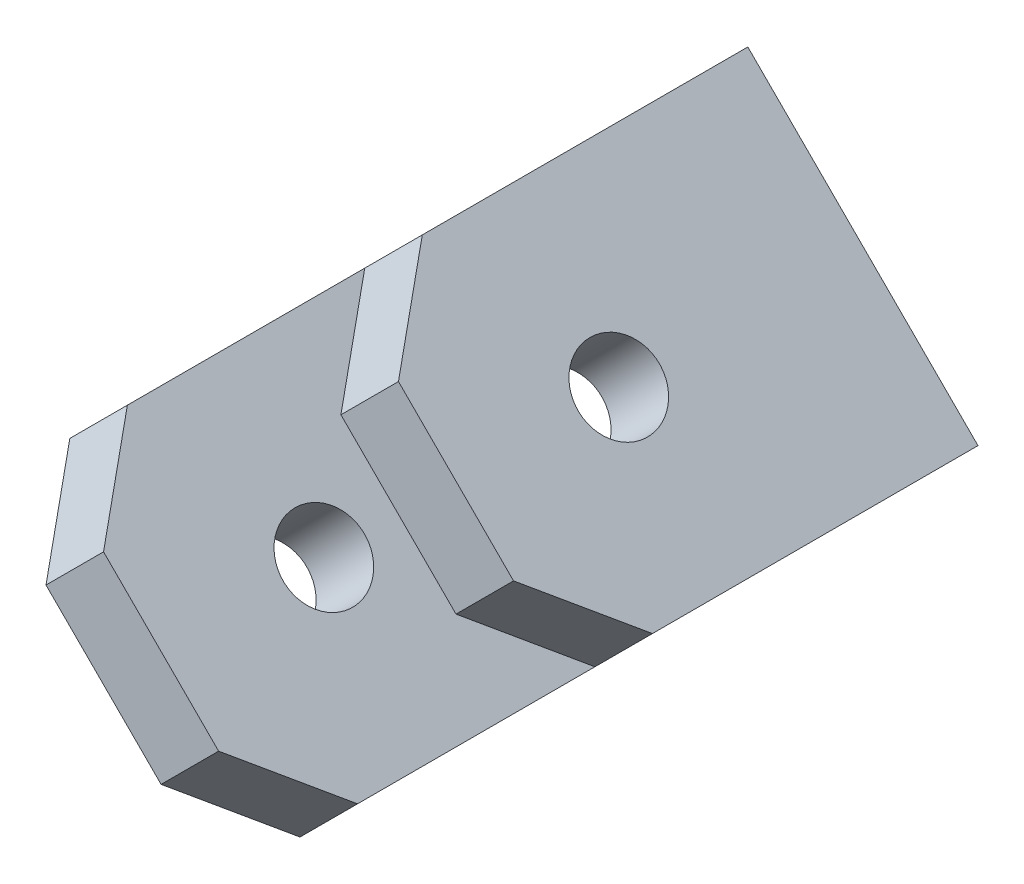
ISO-10303-21;
HEADER;
FILE_DESCRIPTION(('STEP AP214'),'2;1');
FILE_NAME('part.step','',(''),(''),'','','');
FILE_SCHEMA(('AUTOMOTIVE_DESIGN { 1 0 10303 214 1 1 1 1 }'));
ENDSEC;
DATA;
#1=APPLICATION_CONTEXT('core data for automotive mechanical design processes');
#2=APPLICATION_PROTOCOL_DEFINITION('international standard','automotive_design',2000,#1);
#3=PRODUCT_CONTEXT('',#1,'mechanical');
#4=PRODUCT('Part','Part','',(#3));
#5=PRODUCT_RELATED_PRODUCT_CATEGORY('part','',(#4));
#6=PRODUCT_DEFINITION_FORMATION('','',#4);
#7=PRODUCT_DEFINITION_CONTEXT('part definition',#1,'design');
#8=PRODUCT_DEFINITION('design','',#6,#7);
#9=PRODUCT_DEFINITION_SHAPE('','',#8);
#10=(LENGTH_UNIT() NAMED_UNIT(*) SI_UNIT(.MILLI.,.METRE.));
#11=(NAMED_UNIT(*) PLANE_ANGLE_UNIT() SI_UNIT($,.RADIAN.));
#12=(NAMED_UNIT(*) SI_UNIT($,.STERADIAN.) SOLID_ANGLE_UNIT());
#13=UNCERTAINTY_MEASURE_WITH_UNIT(LENGTH_MEASURE(1.E-05),#10,'distance_accuracy_value','');
#14=(GEOMETRIC_REPRESENTATION_CONTEXT(3) GLOBAL_UNCERTAINTY_ASSIGNED_CONTEXT((#13)) GLOBAL_UNIT_ASSIGNED_CONTEXT((#10,
#11,#12)) REPRESENTATION_CONTEXT('',''));
#15=CARTESIAN_POINT('',(0.,0.,0.));
#16=DIRECTION('',(0.,0.,1.));
#17=DIRECTION('',(1.,0.,0.));
#18=AXIS2_PLACEMENT_3D('',#15,#16,#17);
#19=CARTESIAN_POINT('',(90.9250932258255,19.0830442572713,127.));
#20=DIRECTION('',(-0.707106781186543,0.707106781186552,0.));
#21=DIRECTION('',(-0.707106781186552,-0.707106781186543,0.));
#22=AXIS2_PLACEMENT_3D('',#19,#20,#21);
#23=PLANE('',#22);
#24=DIRECTION('',(0.,0.,-1.));
#25=VECTOR('',#24,1.);
#26=CARTESIAN_POINT('',(90.9250932258255,19.0830442572713,127.));
#27=LINE('',#26,#25);
#28=CARTESIAN_POINT('',(90.9250932258255,19.0830442572713,101.6));
#29=VERTEX_POINT('',#28);
#30=CARTESIAN_POINT('',(90.9250932258255,19.0830442572713,0.));
#31=VERTEX_POINT('',#30);
#32=EDGE_CURVE('E124',#29,#31,#27,.T.);
#33=ORIENTED_EDGE('',*,*,#32,.F.);
#34=DIRECTION('',(0.707106781186551,0.707106781186544,0.));
#35=VECTOR('',#34,1.);
#36=CARTESIAN_POINT('',(-55.004068741549,-126.846117710102,101.6));
#37=LINE('',#36,#35);
#38=CARTESIAN_POINT('',(72.964580983687,1.12253201513307,101.6));
#39=VERTEX_POINT('',#38);
#40=EDGE_CURVE('E134',#39,#29,#37,.T.);
#41=ORIENTED_EDGE('',*,*,#40,.F.);
#42=DIRECTION('',(0.,0.,-1.));
#43=VECTOR('',#42,1.);
#44=CARTESIAN_POINT('',(72.964580983687,1.1225320151331,127.));
#45=LINE('',#44,#43);
#46=CARTESIAN_POINT('',(72.964580983687,1.1225320151331,0.));
#47=VERTEX_POINT('',#46);
#48=EDGE_CURVE('E113',#39,#47,#45,.T.);
#49=ORIENTED_EDGE('',*,*,#48,.T.);
#50=DIRECTION('',(0.707106781186552,0.707106781186543,0.));
#51=VECTOR('',#50,1.);
#52=CARTESIAN_POINT('',(90.9250932258255,19.0830442572713,0.));
#53=LINE('',#52,#51);
#54=EDGE_CURVE('E133',#47,#31,#53,.T.);
#55=ORIENTED_EDGE('',*,*,#54,.T.);
#56=EDGE_LOOP('',(#33,#41,#49,#55));
#57=FACE_BOUND('',#56,.T.);
#58=ADVANCED_FACE('F43',(#57),#23,.F.);
#59=CARTESIAN_POINT('',(19.0830442572726,90.9250932258249,127.));
#60=DIRECTION('',(-0.707106781186551,-0.707106781186544,0.));
#61=DIRECTION('',(0.707106781186544,-0.707106781186551,0.));
#62=AXIS2_PLACEMENT_3D('',#59,#60,#61);
#63=PLANE('',#62);
#64=CARTESIAN_POINT('',(55.0040687415489,55.0040687415483,76.2));
#65=DIRECTION('',(0.707106781186551,0.707106781186544,0.));
#66=DIRECTION('',(-0.707106781186544,0.707106781186551,0.));
#67=AXIS2_PLACEMENT_3D('',#64,#65,#66);
#68=CIRCLE('',#67,12.7);
#69=CARTESIAN_POINT('',(46.0238126204798,63.9843248626175,76.2));
#70=VERTEX_POINT('',#69);
#71=EDGE_CURVE('E155',#70,#70,#68,.T.);
#72=ORIENTED_EDGE('',*,*,#71,.F.);
#73=EDGE_LOOP('',(#72));
#74=FACE_BOUND('',#73,.T.);
#75=DIRECTION('',(0.,0.,-1.));
#76=VECTOR('',#75,1.);
#77=CARTESIAN_POINT('',(19.0830442572726,90.9250932258249,127.));
#78=LINE('',#77,#76);
#79=CARTESIAN_POINT('',(19.0830442572722,90.9250932258253,101.6));
#80=VERTEX_POINT('',#79);
#81=CARTESIAN_POINT('',(19.0830442572726,90.9250932258249,0.));
#82=VERTEX_POINT('',#81);
#83=EDGE_CURVE('E106',#80,#82,#78,.T.);
#84=ORIENTED_EDGE('',*,*,#83,.F.);
#85=DIRECTION('',(-0.499999999999998,0.500000000000003,-0.707106781186547));
#86=VECTOR('',#85,1.);
#87=CARTESIAN_POINT('',(37.0435564994106,72.9645809836867,127.));
#88=LINE('',#87,#86);
#89=CARTESIAN_POINT('',(37.0435564994106,72.9645809836867,127.));
#90=VERTEX_POINT('',#89);
#91=EDGE_CURVE('E95',#90,#80,#88,.T.);
#92=ORIENTED_EDGE('',*,*,#91,.F.);
#93=DIRECTION('',(-0.707106781186544,0.707106781186551,0.));
#94=VECTOR('',#93,1.);
#95=CARTESIAN_POINT('',(19.0830442572726,90.9250932258249,127.));
#96=LINE('',#95,#94);
#97=CARTESIAN_POINT('',(72.9645809836871,37.0435564994099,127.));
#98=VERTEX_POINT('',#97);
#99=EDGE_CURVE('E104',#98,#90,#96,.T.);
#100=ORIENTED_EDGE('',*,*,#99,.F.);
#101=DIRECTION('',(-0.499999999999998,0.500000000000003,0.707106781186547));
#102=VECTOR('',#101,1.);
#103=CARTESIAN_POINT('',(72.9645809836871,37.0435564994099,127.));
#104=LINE('',#103,#102);
#105=EDGE_CURVE('E65',#29,#98,#104,.T.);
#106=ORIENTED_EDGE('',*,*,#105,.F.);
#107=ORIENTED_EDGE('',*,*,#32,.T.);
#108=DIRECTION('',(-0.707106781186544,0.707106781186551,0.));
#109=VECTOR('',#108,1.);
#110=CARTESIAN_POINT('',(19.0830442572726,90.9250932258249,0.));
#111=LINE('',#110,#109);
#112=EDGE_CURVE('E137',#31,#82,#111,.T.);
#113=ORIENTED_EDGE('',*,*,#112,.T.);
#114=EDGE_LOOP('',(#84,#92,#100,#106,#107,#113));
#115=FACE_BOUND('',#114,.T.);
#116=ADVANCED_FACE('F103',(#74,#115),#63,.F.);
#117=CARTESIAN_POINT('',(1.12253201513421,72.9645809836867,127.));
#118=DIRECTION('',(0.707106781186544,-0.707106781186551,0.));
#119=DIRECTION('',(0.707106781186551,0.707106781186544,0.));
#120=AXIS2_PLACEMENT_3D('',#117,#118,#119);
#121=PLANE('',#120);
#122=DIRECTION('',(0.,0.,-1.));
#123=VECTOR('',#122,1.);
#124=CARTESIAN_POINT('',(1.12253201513421,72.9645809836867,127.));
#125=LINE('',#124,#123);
#126=CARTESIAN_POINT('',(1.12253201513383,72.964580983687,101.6));
#127=VERTEX_POINT('',#126);
#128=CARTESIAN_POINT('',(1.12253201513421,72.9645809836867,0.));
#129=VERTEX_POINT('',#128);
#130=EDGE_CURVE('E121',#127,#129,#125,.T.);
#131=ORIENTED_EDGE('',*,*,#130,.F.);
#132=DIRECTION('',(0.707106781186551,0.707106781186544,0.));
#133=VECTOR('',#132,1.);
#134=CARTESIAN_POINT('',(-126.846117710102,-55.0040687415477,101.6));
#135=LINE('',#134,#133);
#136=EDGE_CURVE('E107',#127,#80,#135,.T.);
#137=ORIENTED_EDGE('',*,*,#136,.T.);
#138=ORIENTED_EDGE('',*,*,#83,.T.);
#139=DIRECTION('',(-0.707106781186551,-0.707106781186544,0.));
#140=VECTOR('',#139,1.);
#141=CARTESIAN_POINT('',(1.12253201513421,72.9645809836867,0.));
#142=LINE('',#141,#140);
#143=EDGE_CURVE('E116',#82,#129,#142,.T.);
#144=ORIENTED_EDGE('',*,*,#143,.T.);
#145=EDGE_LOOP('',(#131,#137,#138,#144));
#146=FACE_BOUND('',#145,.T.);
#147=ADVANCED_FACE('F147',(#146),#121,.F.);
#148=CARTESIAN_POINT('',(1.12253201513421,72.9645809836867,127.));
#149=DIRECTION('',(0.707106781186551,0.707106781186544,0.));
#150=DIRECTION('',(-0.707106781186544,0.707106781186551,0.));
#151=AXIS2_PLACEMENT_3D('',#148,#149,#150);
#152=PLANE('',#151);
#153=CARTESIAN_POINT('',(37.0435564994104,37.04355649941,76.2));
#154=DIRECTION('',(0.707106781186551,0.707106781186544,0.));
#155=DIRECTION('',(-0.707106781186544,0.707106781186551,0.));
#156=AXIS2_PLACEMENT_3D('',#153,#154,#155);
#157=CIRCLE('',#156,12.7);
#158=CARTESIAN_POINT('',(28.0633003783413,46.0238126204793,76.2));
#159=VERTEX_POINT('',#158);
#160=EDGE_CURVE('E46',#159,#159,#157,.T.);
#161=ORIENTED_EDGE('',*,*,#160,.T.);
#162=EDGE_LOOP('',(#161));
#163=FACE_BOUND('',#162,.T.);
#164=DIRECTION('',(0.707106781186544,-0.707106781186551,0.));
#165=VECTOR('',#164,1.);
#166=CARTESIAN_POINT('',(1.12253201513421,72.9645809836867,127.));
#167=LINE('',#166,#165);
#168=CARTESIAN_POINT('',(19.0830442572722,55.0040687415485,127.));
#169=VERTEX_POINT('',#168);
#170=CARTESIAN_POINT('',(55.0040687415487,19.0830442572717,127.));
#171=VERTEX_POINT('',#170);
#172=EDGE_CURVE('E110',#169,#171,#167,.T.);
#173=ORIENTED_EDGE('',*,*,#172,.F.);
#174=DIRECTION('',(-0.499999999999998,0.500000000000003,-0.707106781186547));
#175=VECTOR('',#174,1.);
#176=CARTESIAN_POINT('',(10.1027881362032,63.9843248626176,114.3));
#177=LINE('',#176,#175);
#178=EDGE_CURVE('E57',#169,#127,#177,.T.);
#179=ORIENTED_EDGE('',*,*,#178,.T.);
#180=ORIENTED_EDGE('',*,*,#130,.T.);
#181=DIRECTION('',(0.707106781186544,-0.707106781186551,0.));
#182=VECTOR('',#181,1.);
#183=CARTESIAN_POINT('',(1.12253201513421,72.9645809836867,0.));
#184=LINE('',#183,#182);
#185=EDGE_CURVE('E111',#129,#47,#184,.T.);
#186=ORIENTED_EDGE('',*,*,#185,.T.);
#187=ORIENTED_EDGE('',*,*,#48,.F.);
#188=DIRECTION('',(-0.499999999999998,0.500000000000003,0.707106781186547));
#189=VECTOR('',#188,1.);
#190=CARTESIAN_POINT('',(28.0633003783414,46.0238126204792,165.1));
#191=LINE('',#190,#189);
#192=EDGE_CURVE('E128',#39,#171,#191,.T.);
#193=ORIENTED_EDGE('',*,*,#192,.T.);
#194=EDGE_LOOP('',(#173,#179,#180,#186,#187,#193));
#195=FACE_BOUND('',#194,.T.);
#196=ADVANCED_FACE('F132',(#163,#195),#152,.F.);
#197=CARTESIAN_POINT('',(72.9645809836871,1.12253201513308,127.));
#198=DIRECTION('',(0.,0.,1.));
#199=DIRECTION('',(1.,0.,0.));
#200=AXIS2_PLACEMENT_3D('',#197,#198,#199);
#201=PLANE('',#200);
#202=DIRECTION('',(0.707106781186551,0.707106781186544,0.));
#203=VECTOR('',#202,1.);
#204=CARTESIAN_POINT('',(19.0830442572722,55.0040687415485,127.));
#205=LINE('',#204,#203);
#206=EDGE_CURVE('E12',#169,#90,#205,.T.);
#207=ORIENTED_EDGE('',*,*,#206,.F.);
#208=ORIENTED_EDGE('',*,*,#172,.T.);
#209=DIRECTION('',(-0.707106781186551,-0.707106781186544,0.));
#210=VECTOR('',#209,1.);
#211=CARTESIAN_POINT('',(55.0040687415487,19.0830442572717,127.));
#212=LINE('',#211,#210);
#213=EDGE_CURVE('E51',#98,#171,#212,.T.);
#214=ORIENTED_EDGE('',*,*,#213,.F.);
#215=ORIENTED_EDGE('',*,*,#99,.T.);
#216=EDGE_LOOP('',(#207,#208,#214,#215));
#217=FACE_BOUND('',#216,.T.);
#218=ADVANCED_FACE('F109',(#217),#201,.T.);
#219=CARTESIAN_POINT('',(72.9645809836871,1.12253201513308,0.));
#220=DIRECTION('',(0.,0.,1.));
#221=DIRECTION('',(1.,0.,0.));
#222=AXIS2_PLACEMENT_3D('',#219,#220,#221);
#223=PLANE('',#222);
#224=ORIENTED_EDGE('',*,*,#54,.F.);
#225=ORIENTED_EDGE('',*,*,#185,.F.);
#226=ORIENTED_EDGE('',*,*,#143,.F.);
#227=ORIENTED_EDGE('',*,*,#112,.F.);
#228=EDGE_LOOP('',(#224,#225,#226,#227));
#229=FACE_BOUND('',#228,.T.);
#230=ADVANCED_FACE('F151',(#229),#223,.F.);
#231=CARTESIAN_POINT('',(-72.9645809836874,-108.885605467963,127.));
#232=DIRECTION('',(-0.499999999999997,0.500000000000002,-0.707106781186548));
#233=DIRECTION('',(0.,0.816496580927725,0.577350269189628));
#234=AXIS2_PLACEMENT_3D('',#231,#232,#233);
#235=PLANE('',#234);
#236=ORIENTED_EDGE('',*,*,#40,.T.);
#237=ORIENTED_EDGE('',*,*,#105,.T.);
#238=ORIENTED_EDGE('',*,*,#213,.T.);
#239=ORIENTED_EDGE('',*,*,#192,.F.);
#240=EDGE_LOOP('',(#236,#237,#238,#239));
#241=FACE_BOUND('',#240,.T.);
#242=ADVANCED_FACE('F127',(#241),#235,.F.);
#243=CARTESIAN_POINT('',(-108.885605467964,-72.9645809836863,127.));
#244=DIRECTION('',(0.499999999999997,-0.500000000000002,-0.707106781186548));
#245=DIRECTION('',(0.,0.816496580927725,-0.577350269189628));
#246=AXIS2_PLACEMENT_3D('',#243,#244,#245);
#247=PLANE('',#246);
#248=ORIENTED_EDGE('',*,*,#206,.T.);
#249=ORIENTED_EDGE('',*,*,#91,.T.);
#250=ORIENTED_EDGE('',*,*,#136,.F.);
#251=ORIENTED_EDGE('',*,*,#178,.F.);
#252=EDGE_LOOP('',(#248,#249,#250,#251));
#253=FACE_BOUND('',#252,.T.);
#254=ADVANCED_FACE('F94',(#253),#247,.F.);
#255=CARTESIAN_POINT('',(-90.9250932258256,-90.9250932258247,76.2));
#256=DIRECTION('',(0.707106781186551,0.707106781186544,0.));
#257=DIRECTION('',(-0.707106781186544,0.707106781186551,0.));
#258=AXIS2_PLACEMENT_3D('',#255,#256,#257);
#259=CYLINDRICAL_SURFACE('',#258,12.7);
#260=CARTESIAN_POINT('',(46.0238126204798,63.9843248626175,76.2));
#261=CARTESIAN_POINT('',(45.8367239512908,63.7972361934286,76.2));
#262=CARTESIAN_POINT('',(45.6496352821019,63.6101475242396,76.2));
#263=CARTESIAN_POINT('',(45.275457943724,63.2359701858618,76.2));
#264=CARTESIAN_POINT('',(45.088369274535,63.0488815166728,76.2));
#265=CARTESIAN_POINT('',(44.7141919361572,62.6747041782949,76.2));
#266=CARTESIAN_POINT('',(44.5271032669682,62.487615509106,76.2));
#267=CARTESIAN_POINT('',(44.1529259285904,62.1134381707281,76.2));
#268=CARTESIAN_POINT('',(43.9658372594014,61.9263495015392,76.2));
#269=CARTESIAN_POINT('',(43.5916599210235,61.5521721631613,76.2));
#270=CARTESIAN_POINT('',(43.4045712518346,61.3650834939724,76.2));
#271=CARTESIAN_POINT('',(43.0303939134567,60.9909061555945,76.2));
#272=CARTESIAN_POINT('',(42.8433052442677,60.8038174864055,76.2));
#273=CARTESIAN_POINT('',(42.4691279058899,60.4296401480277,76.2));
#274=CARTESIAN_POINT('',(42.2820392367009,60.2425514788387,76.2));
#275=CARTESIAN_POINT('',(41.907861898323,59.8683741404608,76.2));
#276=CARTESIAN_POINT('',(41.7207732291341,59.6812854712719,76.2));
#277=CARTESIAN_POINT('',(41.3465958907562,59.307108132894,76.2));
#278=CARTESIAN_POINT('',(41.1595072215673,59.1200194637051,76.2));
#279=CARTESIAN_POINT('',(40.7853298831894,58.7458421253272,76.2));
#280=CARTESIAN_POINT('',(40.5982412140004,58.5587534561383,76.2));
#281=CARTESIAN_POINT('',(40.2240638756225,58.1845761177604,76.2));
#282=CARTESIAN_POINT('',(40.0369752064336,57.9974874485714,76.2));
#283=CARTESIAN_POINT('',(39.6627978680557,57.6233101101935,76.2));
#284=CARTESIAN_POINT('',(39.4757091988668,57.4362214410046,76.2));
#285=CARTESIAN_POINT('',(39.1015318604889,57.0620441026267,76.2));
#286=CARTESIAN_POINT('',(38.9144431913,56.8749554334378,76.2));
#287=CARTESIAN_POINT('',(38.5402658529221,56.5007780950599,76.2));
#288=CARTESIAN_POINT('',(38.3531771837331,56.313689425871,76.2));
#289=CARTESIAN_POINT('',(37.9789998453552,55.9395120874931,76.2));
#290=CARTESIAN_POINT('',(37.7919111761663,55.7524234183042,76.2));
#291=CARTESIAN_POINT('',(37.4177338377884,55.3782460799263,76.2));
#292=CARTESIAN_POINT('',(37.2306451685995,55.1911574107373,76.2));
#293=CARTESIAN_POINT('',(36.8564678302216,54.8169800723595,76.2));
#294=CARTESIAN_POINT('',(36.6693791610327,54.6298914031705,76.2));
#295=CARTESIAN_POINT('',(36.2952018226548,54.2557140647926,76.2));
#296=CARTESIAN_POINT('',(36.1081131534658,54.0686253956037,76.2));
#297=CARTESIAN_POINT('',(35.733935815088,53.6944480572258,76.2));
#298=CARTESIAN_POINT('',(35.546847145899,53.5073593880369,76.2));
#299=CARTESIAN_POINT('',(35.1726698075211,53.133182049659,76.2));
#300=CARTESIAN_POINT('',(34.9855811383322,52.9460933804701,76.2));
#301=CARTESIAN_POINT('',(34.6114037999543,52.5719160420922,76.2));
#302=CARTESIAN_POINT('',(34.4243151307654,52.3848273729032,76.2));
#303=CARTESIAN_POINT('',(34.0501377923875,52.0106500345254,76.2));
#304=CARTESIAN_POINT('',(33.8630491231985,51.8235613653364,76.2));
#305=CARTESIAN_POINT('',(33.4888717848207,51.4493840269585,76.2));
#306=CARTESIAN_POINT('',(33.3017831156317,51.2622953577696,76.2));
#307=CARTESIAN_POINT('',(32.9276057772538,50.8881180193917,76.2));
#308=CARTESIAN_POINT('',(32.7405171080649,50.7010293502028,76.2));
#309=CARTESIAN_POINT('',(32.366339769687,50.3268520118249,76.2));
#310=CARTESIAN_POINT('',(32.1792511004981,50.139763342636,76.2));
#311=CARTESIAN_POINT('',(31.8050737621202,49.7655860042581,76.2));
#312=CARTESIAN_POINT('',(31.6179850929312,49.5784973350692,76.2));
#313=CARTESIAN_POINT('',(31.2438077545533,49.2043199966913,76.2));
#314=CARTESIAN_POINT('',(31.0567190853644,49.0172313275023,76.2));
#315=CARTESIAN_POINT('',(30.6825417469865,48.6430539891244,76.2));
#316=CARTESIAN_POINT('',(30.4954530777976,48.4559653199355,76.2));
#317=CARTESIAN_POINT('',(30.1212757394197,48.0817879815576,76.2));
#318=CARTESIAN_POINT('',(29.9341870702308,47.8946993123687,76.2));
#319=CARTESIAN_POINT('',(29.5600097318529,47.5205219739908,76.2));
#320=CARTESIAN_POINT('',(29.3729210626639,47.3334333048018,76.2));
#321=CARTESIAN_POINT('',(28.998743724286,46.959255966424,76.2));
#322=CARTESIAN_POINT('',(28.8116550550971,46.772167297235,76.2));
#323=CARTESIAN_POINT('',(28.4374777167192,46.3979899588572,76.2));
#324=CARTESIAN_POINT('',(28.2503890475303,46.2109012896682,76.2));
#325=CARTESIAN_POINT('',(28.0633003783413,46.0238126204793,76.2));
#326=B_SPLINE_CURVE_WITH_KNOTS('',3,(#260,#261,#262,#263,#264,#265,#266,#267,#268,#269,#270,
#271,#272,#273,#274,#275,#276,#277,#278,#279,#280,#281,#282,#283,#284,#285,#286,#287,#288,#289,
#290,#291,#292,#293,#294,#295,#296,#297,#298,#299,#300,#301,#302,#303,#304,#305,#306,#307,#308,
#309,#310,#311,#312,#313,#314,#315,#316,#317,#318,#319,#320,#321,#322,#323,#324,#325),
.UNSPECIFIED.,.F.,.F.,(4,2,2,2,2,2,2,2,2,2,2,2,2,2,2,2,2,2,2,2,2,2,2,2,2,2,2,2,2,2,2,2,4),(0.,
0.793750000000007,1.58749999999999,2.38125,3.17500000000001,3.96874999999999,4.7625,
5.55625000000001,6.35000000000001,7.14375,7.93750000000001,8.73125000000001,9.525,10.31875,
11.1125,11.90625,12.7,13.49375,14.2875,15.08125,15.875,16.66875,17.4625,18.25625,19.05,19.84375,
20.6375,21.43125,22.225,23.01875,23.8125,24.60625,25.4),.UNSPECIFIED.);
#327=EDGE_CURVE('BSEAM163',#70,#159,#326,.T.);
#328=ORIENTED_EDGE('',*,*,#71,.T.);
#329=ORIENTED_EDGE('',*,*,#160,.F.);
#330=ORIENTED_EDGE('',*,*,#327,.T.);
#331=ORIENTED_EDGE('',*,*,#327,.F.);
#332=EDGE_LOOP('',(#328,#330,#329,#331));
#333=FACE_BOUND('',#332,.T.);
#334=ADVANCED_FACE('F163',(#333),#259,.F.);
#335=CLOSED_SHELL('',(#58,#116,#147,#196,#218,#230,#242,#254,#334));
#336=MANIFOLD_SOLID_BREP('B2',#335);
#337=CARTESIAN_POINT('',(-72.9645809836867,-1.12253201513344,127.));
#338=DIRECTION('',(0.707106781186544,-0.707106781186551,0.));
#339=DIRECTION('',(0.707106781186551,0.707106781186544,0.));
#340=AXIS2_PLACEMENT_3D('',#337,#338,#339);
#341=PLANE('',#340);
#342=DIRECTION('',(0.,0.,-1.));
#343=VECTOR('',#342,1.);
#344=CARTESIAN_POINT('',(-90.9250932258251,-19.0830442572717,127.));
#345=LINE('',#344,#343);
#346=CARTESIAN_POINT('',(-90.9250932258254,-19.0830442572713,101.6));
#347=VERTEX_POINT('',#346);
#348=CARTESIAN_POINT('',(-90.9250932258251,-19.0830442572717,0.));
#349=VERTEX_POINT('',#348);
#350=EDGE_CURVE('E308',#347,#349,#345,.T.);
#351=ORIENTED_EDGE('',*,*,#350,.F.);
#352=DIRECTION('',(0.707106781186551,0.707106781186544,0.));
#353=VECTOR('',#352,1.);
#354=CARTESIAN_POINT('',(-126.846117710102,-55.0040687415477,101.6));
#355=LINE('',#354,#353);
#356=CARTESIAN_POINT('',(-72.964580983687,-1.12253201513308,101.6));
#357=VERTEX_POINT('',#356);
#358=EDGE_CURVE('E294',#347,#357,#355,.T.);
#359=ORIENTED_EDGE('',*,*,#358,.T.);
#360=DIRECTION('',(0.,0.,-1.));
#361=VECTOR('',#360,1.);
#362=CARTESIAN_POINT('',(-72.9645809836867,-1.12253201513344,127.));
#363=LINE('',#362,#361);
#364=CARTESIAN_POINT('',(-72.9645809836867,-1.12253201513344,0.));
#365=VERTEX_POINT('',#364);
#366=EDGE_CURVE('E293',#357,#365,#363,.T.);
#367=ORIENTED_EDGE('',*,*,#366,.T.);
#368=DIRECTION('',(-0.707106781186551,-0.707106781186544,0.));
#369=VECTOR('',#368,1.);
#370=CARTESIAN_POINT('',(-72.9645809836867,-1.12253201513344,0.));
#371=LINE('',#370,#369);
#372=EDGE_CURVE('E318',#365,#349,#371,.T.);
#373=ORIENTED_EDGE('',*,*,#372,.T.);
#374=EDGE_LOOP('',(#351,#359,#367,#373));
#375=FACE_BOUND('',#374,.T.);
#376=ADVANCED_FACE('F230',(#375),#341,.F.);
#377=CARTESIAN_POINT('',(-90.9250932258251,-19.0830442572717,127.));
#378=DIRECTION('',(0.707106781186551,0.707106781186544,0.));
#379=DIRECTION('',(-0.707106781186544,0.707106781186551,0.));
#380=AXIS2_PLACEMENT_3D('',#377,#378,#379);
#381=PLANE('',#380);
#382=CARTESIAN_POINT('',(-55.0040687415488,-55.0040687415483,76.2));
#383=DIRECTION('',(0.707106781186551,0.707106781186544,0.));
#384=DIRECTION('',(-0.707106781186544,0.707106781186551,0.));
#385=AXIS2_PLACEMENT_3D('',#382,#383,#384);
#386=CIRCLE('',#385,12.7);
#387=CARTESIAN_POINT('',(-63.9843248626179,-46.0238126204791,76.2));
#388=VERTEX_POINT('',#387);
#389=EDGE_CURVE('E339',#388,#388,#386,.T.);
#390=ORIENTED_EDGE('',*,*,#389,.T.);
#391=EDGE_LOOP('',(#390));
#392=FACE_BOUND('',#391,.T.);
#393=DIRECTION('',(0.707106781186544,-0.707106781186551,0.));
#394=VECTOR('',#393,1.);
#395=CARTESIAN_POINT('',(-90.9250932258251,-19.0830442572717,127.));
#396=LINE('',#395,#394);
#397=CARTESIAN_POINT('',(-72.964580983687,-37.0435564994099,127.));
#398=VERTEX_POINT('',#397);
#399=CARTESIAN_POINT('',(-37.0435564994106,-72.9645809836867,127.));
#400=VERTEX_POINT('',#399);
#401=EDGE_CURVE('E297',#398,#400,#396,.T.);
#402=ORIENTED_EDGE('',*,*,#401,.F.);
#403=DIRECTION('',(-0.499999999999997,0.500000000000003,-0.707106781186547));
#404=VECTOR('',#403,1.);
#405=CARTESIAN_POINT('',(-81.9448371047561,-28.0633003783408,114.3));
#406=LINE('',#405,#404);
#407=EDGE_CURVE('E244',#398,#347,#406,.T.);
#408=ORIENTED_EDGE('',*,*,#407,.T.);
#409=ORIENTED_EDGE('',*,*,#350,.T.);
#410=DIRECTION('',(0.707106781186544,-0.707106781186551,0.));
#411=VECTOR('',#410,1.);
#412=CARTESIAN_POINT('',(-90.9250932258251,-19.0830442572717,0.));
#413=LINE('',#412,#411);
#414=CARTESIAN_POINT('',(-19.0830442572723,-90.9250932258252,0.));
#415=VERTEX_POINT('',#414);
#416=EDGE_CURVE('E321',#349,#415,#413,.T.);
#417=ORIENTED_EDGE('',*,*,#416,.T.);
#418=DIRECTION('',(0.,0.,-1.));
#419=VECTOR('',#418,1.);
#420=CARTESIAN_POINT('',(-19.0830442572723,-90.9250932258252,127.));
#421=LINE('',#420,#419);
#422=CARTESIAN_POINT('',(-19.0830442572722,-90.9250932258253,101.6));
#423=VERTEX_POINT('',#422);
#424=EDGE_CURVE('E306',#423,#415,#421,.T.);
#425=ORIENTED_EDGE('',*,*,#424,.F.);
#426=DIRECTION('',(-0.499999999999997,0.500000000000003,0.707106781186547));
#427=VECTOR('',#426,1.);
#428=CARTESIAN_POINT('',(-63.9843248626179,-46.0238126204792,165.1));
#429=LINE('',#428,#427);
#430=EDGE_CURVE('E312',#423,#400,#429,.T.);
#431=ORIENTED_EDGE('',*,*,#430,.T.);
#432=EDGE_LOOP('',(#402,#408,#409,#417,#425,#431));
#433=FACE_BOUND('',#432,.T.);
#434=ADVANCED_FACE('F316',(#392,#433),#381,.F.);
#435=CARTESIAN_POINT('',(-19.0830442572723,-90.9250932258252,127.));
#436=DIRECTION('',(-0.707106781186543,0.707106781186552,0.));
#437=DIRECTION('',(-0.707106781186552,-0.707106781186543,0.));
#438=AXIS2_PLACEMENT_3D('',#435,#436,#437);
#439=PLANE('',#438);
#440=DIRECTION('',(0.,0.,-1.));
#441=VECTOR('',#440,1.);
#442=CARTESIAN_POINT('',(-1.12253201513385,-72.964580983687,127.));
#443=LINE('',#442,#441);
#444=CARTESIAN_POINT('',(-1.12253201513385,-72.9645809836871,101.6));
#445=VERTEX_POINT('',#444);
#446=CARTESIAN_POINT('',(-1.12253201513385,-72.964580983687,0.));
#447=VERTEX_POINT('',#446);
#448=EDGE_CURVE('E299',#445,#447,#443,.T.);
#449=ORIENTED_EDGE('',*,*,#448,.F.);
#450=DIRECTION('',(0.707106781186551,0.707106781186544,0.));
#451=VECTOR('',#450,1.);
#452=CARTESIAN_POINT('',(-55.004068741549,-126.846117710102,101.6));
#453=LINE('',#452,#451);
#454=EDGE_CURVE('E323',#423,#445,#453,.T.);
#455=ORIENTED_EDGE('',*,*,#454,.F.);
#456=ORIENTED_EDGE('',*,*,#424,.T.);
#457=DIRECTION('',(0.707106781186552,0.707106781186543,0.));
#458=VECTOR('',#457,1.);
#459=CARTESIAN_POINT('',(-19.0830442572723,-90.9250932258252,0.));
#460=LINE('',#459,#458);
#461=EDGE_CURVE('E328',#415,#447,#460,.T.);
#462=ORIENTED_EDGE('',*,*,#461,.T.);
#463=EDGE_LOOP('',(#449,#455,#456,#462));
#464=FACE_BOUND('',#463,.T.);
#465=ADVANCED_FACE('F345',(#464),#439,.F.);
#466=CARTESIAN_POINT('',(-72.9645809836867,-1.12253201513344,127.));
#467=DIRECTION('',(-0.707106781186551,-0.707106781186544,0.));
#468=DIRECTION('',(0.707106781186544,-0.707106781186551,0.));
#469=AXIS2_PLACEMENT_3D('',#466,#467,#468);
#470=PLANE('',#469);
#471=CARTESIAN_POINT('',(-37.0435564994104,-37.0435564994101,76.2));
#472=DIRECTION('',(-0.707106781186551,-0.707106781186544,0.));
#473=DIRECTION('',(0.707106781186544,-0.707106781186551,0.));
#474=AXIS2_PLACEMENT_3D('',#471,#472,#473);
#475=CIRCLE('',#474,12.7);
#476=CARTESIAN_POINT('',(-46.0238126204795,-28.0633003783409,76.2));
#477=VERTEX_POINT('',#476);
#478=EDGE_CURVE('E233',#477,#477,#475,.T.);
#479=ORIENTED_EDGE('',*,*,#478,.T.);
#480=EDGE_LOOP('',(#479));
#481=FACE_BOUND('',#480,.T.);
#482=ORIENTED_EDGE('',*,*,#366,.F.);
#483=DIRECTION('',(0.499999999999997,-0.500000000000003,0.707106781186547));
#484=VECTOR('',#483,1.);
#485=CARTESIAN_POINT('',(-63.9843248626177,-10.1027881362026,114.3));
#486=LINE('',#485,#484);
#487=CARTESIAN_POINT('',(-55.0040687415487,-19.0830442572717,127.));
#488=VERTEX_POINT('',#487);
#489=EDGE_CURVE('E282',#357,#488,#486,.T.);
#490=ORIENTED_EDGE('',*,*,#489,.T.);
#491=DIRECTION('',(-0.707106781186544,0.707106781186551,0.));
#492=VECTOR('',#491,1.);
#493=CARTESIAN_POINT('',(-72.9645809836867,-1.12253201513344,127.));
#494=LINE('',#493,#492);
#495=CARTESIAN_POINT('',(-19.0830442572722,-55.0040687415485,127.));
#496=VERTEX_POINT('',#495);
#497=EDGE_CURVE('E291',#496,#488,#494,.T.);
#498=ORIENTED_EDGE('',*,*,#497,.F.);
#499=DIRECTION('',(0.499999999999997,-0.500000000000003,-0.707106781186547));
#500=VECTOR('',#499,1.);
#501=CARTESIAN_POINT('',(-46.0238126204795,-28.063300378341,165.1));
#502=LINE('',#501,#500);
#503=EDGE_CURVE('E252',#496,#445,#502,.T.);
#504=ORIENTED_EDGE('',*,*,#503,.T.);
#505=ORIENTED_EDGE('',*,*,#448,.T.);
#506=DIRECTION('',(-0.707106781186544,0.707106781186551,0.));
#507=VECTOR('',#506,1.);
#508=CARTESIAN_POINT('',(-72.9645809836867,-1.12253201513344,0.));
#509=LINE('',#508,#507);
#510=EDGE_CURVE('E301',#447,#365,#509,.T.);
#511=ORIENTED_EDGE('',*,*,#510,.T.);
#512=EDGE_LOOP('',(#482,#490,#498,#504,#505,#511));
#513=FACE_BOUND('',#512,.T.);
#514=ADVANCED_FACE('F290',(#481,#513),#470,.F.);
#515=CARTESIAN_POINT('',(-90.9250932258251,-19.0830442572717,127.));
#516=DIRECTION('',(0.,0.,1.));
#517=DIRECTION('',(1.,0.,0.));
#518=AXIS2_PLACEMENT_3D('',#515,#516,#517);
#519=PLANE('',#518);
#520=DIRECTION('',(0.707106781186551,0.707106781186544,0.));
#521=VECTOR('',#520,1.);
#522=CARTESIAN_POINT('',(-72.964580983687,-37.0435564994099,127.));
#523=LINE('',#522,#521);
#524=EDGE_CURVE('E41',#398,#488,#523,.T.);
#525=ORIENTED_EDGE('',*,*,#524,.F.);
#526=ORIENTED_EDGE('',*,*,#401,.T.);
#527=DIRECTION('',(-0.707106781186551,-0.707106781186544,0.));
#528=VECTOR('',#527,1.);
#529=CARTESIAN_POINT('',(-37.0435564994106,-72.9645809836867,127.));
#530=LINE('',#529,#528);
#531=EDGE_CURVE('E238',#496,#400,#530,.T.);
#532=ORIENTED_EDGE('',*,*,#531,.F.);
#533=ORIENTED_EDGE('',*,*,#497,.T.);
#534=EDGE_LOOP('',(#525,#526,#532,#533));
#535=FACE_BOUND('',#534,.T.);
#536=ADVANCED_FACE('F296',(#535),#519,.T.);
#537=CARTESIAN_POINT('',(-90.9250932258251,-19.0830442572717,0.));
#538=DIRECTION('',(0.,0.,1.));
#539=DIRECTION('',(1.,0.,0.));
#540=AXIS2_PLACEMENT_3D('',#537,#538,#539);
#541=PLANE('',#540);
#542=ORIENTED_EDGE('',*,*,#372,.F.);
#543=ORIENTED_EDGE('',*,*,#510,.F.);
#544=ORIENTED_EDGE('',*,*,#461,.F.);
#545=ORIENTED_EDGE('',*,*,#416,.F.);
#546=EDGE_LOOP('',(#542,#543,#544,#545));
#547=FACE_BOUND('',#546,.T.);
#548=ADVANCED_FACE('F336',(#547),#541,.F.);
#549=CARTESIAN_POINT('',(-72.9645809836874,-108.885605467963,127.));
#550=DIRECTION('',(-0.499999999999997,0.500000000000002,-0.707106781186548));
#551=DIRECTION('',(0.,0.816496580927725,0.577350269189628));
#552=AXIS2_PLACEMENT_3D('',#549,#550,#551);
#553=PLANE('',#552);
#554=ORIENTED_EDGE('',*,*,#454,.T.);
#555=ORIENTED_EDGE('',*,*,#503,.F.);
#556=ORIENTED_EDGE('',*,*,#531,.T.);
#557=ORIENTED_EDGE('',*,*,#430,.F.);
#558=EDGE_LOOP('',(#554,#555,#556,#557));
#559=FACE_BOUND('',#558,.T.);
#560=ADVANCED_FACE('F311',(#559),#553,.F.);
#561=CARTESIAN_POINT('',(-108.885605467964,-72.9645809836863,127.));
#562=DIRECTION('',(0.499999999999997,-0.500000000000002,-0.707106781186548));
#563=DIRECTION('',(0.,0.816496580927725,-0.577350269189628));
#564=AXIS2_PLACEMENT_3D('',#561,#562,#563);
#565=PLANE('',#564);
#566=ORIENTED_EDGE('',*,*,#524,.T.);
#567=ORIENTED_EDGE('',*,*,#489,.F.);
#568=ORIENTED_EDGE('',*,*,#358,.F.);
#569=ORIENTED_EDGE('',*,*,#407,.F.);
#570=EDGE_LOOP('',(#566,#567,#568,#569));
#571=FACE_BOUND('',#570,.T.);
#572=ADVANCED_FACE('F281',(#571),#565,.F.);
#573=CARTESIAN_POINT('',(-90.9250932258256,-90.9250932258247,76.2));
#574=DIRECTION('',(0.707106781186551,0.707106781186544,0.));
#575=DIRECTION('',(-0.707106781186544,0.707106781186551,0.));
#576=AXIS2_PLACEMENT_3D('',#573,#574,#575);
#577=CYLINDRICAL_SURFACE('',#576,12.7);
#578=CARTESIAN_POINT('',(-46.0238126204795,-28.0633003783409,76.2));
#579=CARTESIAN_POINT('',(-46.2109012896685,-28.2503890475298,76.2));
#580=CARTESIAN_POINT('',(-46.3979899588574,-28.4374777167187,76.2));
#581=CARTESIAN_POINT('',(-46.7721672972353,-28.8116550550966,76.2));
#582=CARTESIAN_POINT('',(-46.9592559664243,-28.9987437242856,76.2));
#583=CARTESIAN_POINT('',(-47.3334333048021,-29.3729210626634,76.2));
#584=CARTESIAN_POINT('',(-47.5205219739911,-29.5600097318524,76.2));
#585=CARTESIAN_POINT('',(-47.894699312369,-29.9341870702303,76.2));
#586=CARTESIAN_POINT('',(-48.0817879815579,-30.1212757394192,76.2));
#587=CARTESIAN_POINT('',(-48.4559653199358,-30.4954530777971,76.2));
#588=CARTESIAN_POINT('',(-48.6430539891247,-30.682541746986,76.2));
#589=CARTESIAN_POINT('',(-49.0172313275026,-31.0567190853639,76.2));
#590=CARTESIAN_POINT('',(-49.2043199966916,-31.2438077545528,76.2));
#591=CARTESIAN_POINT('',(-49.5784973350694,-31.6179850929307,76.2));
#592=CARTESIAN_POINT('',(-49.7655860042584,-31.8050737621197,76.2));
#593=CARTESIAN_POINT('',(-50.1397633426363,-32.1792511004975,76.2));
#594=CARTESIAN_POINT('',(-50.3268520118252,-32.3663397696865,76.2));
#595=CARTESIAN_POINT('',(-50.7010293502031,-32.7405171080644,76.2));
#596=CARTESIAN_POINT('',(-50.888118019392,-32.9276057772533,76.2));
#597=CARTESIAN_POINT('',(-51.2622953577699,-33.3017831156312,76.2));
#598=CARTESIAN_POINT('',(-51.4493840269589,-33.4888717848201,76.2));
#599=CARTESIAN_POINT('',(-51.8235613653367,-33.863049123198,76.2));
#600=CARTESIAN_POINT('',(-52.0106500345257,-34.0501377923869,76.2));
#601=CARTESIAN_POINT('',(-52.3848273729036,-34.4243151307648,76.2));
#602=CARTESIAN_POINT('',(-52.5719160420925,-34.6114037999538,76.2));
#603=CARTESIAN_POINT('',(-52.9460933804704,-34.9855811383316,76.2));
#604=CARTESIAN_POINT('',(-53.1331820496593,-35.1726698075206,76.2));
#605=CARTESIAN_POINT('',(-53.5073593880372,-35.5468471458985,76.2));
#606=CARTESIAN_POINT('',(-53.6944480572261,-35.7339358150874,76.2));
#607=CARTESIAN_POINT('',(-54.068625395604,-36.1081131534653,76.2));
#608=CARTESIAN_POINT('',(-54.255714064793,-36.2952018226542,76.2));
#609=CARTESIAN_POINT('',(-54.6298914031709,-36.6693791610321,76.2));
#610=CARTESIAN_POINT('',(-54.8169800723598,-36.856467830221,76.2));
#611=CARTESIAN_POINT('',(-55.1911574107377,-37.2306451685989,76.2));
#612=CARTESIAN_POINT('',(-55.3782460799266,-37.4177338377878,76.2));
#613=CARTESIAN_POINT('',(-55.7524234183045,-37.7919111761657,76.2));
#614=CARTESIAN_POINT('',(-55.9395120874935,-37.9789998453547,76.2));
#615=CARTESIAN_POINT('',(-56.3136894258713,-38.3531771837326,76.2));
#616=CARTESIAN_POINT('',(-56.5007780950603,-38.5402658529215,76.2));
#617=CARTESIAN_POINT('',(-56.8749554334382,-38.9144431912994,76.2));
#618=CARTESIAN_POINT('',(-57.0620441026271,-39.1015318604883,76.2));
#619=CARTESIAN_POINT('',(-57.436221441005,-39.4757091988662,76.2));
#620=CARTESIAN_POINT('',(-57.6233101101939,-39.6627978680551,76.2));
#621=CARTESIAN_POINT('',(-57.9974874485718,-40.036975206433,76.2));
#622=CARTESIAN_POINT('',(-58.1845761177608,-40.2240638756219,76.2));
#623=CARTESIAN_POINT('',(-58.5587534561386,-40.5982412139998,76.2));
#624=CARTESIAN_POINT('',(-58.7458421253276,-40.7853298831888,76.2));
#625=CARTESIAN_POINT('',(-59.1200194637055,-41.1595072215666,76.2));
#626=CARTESIAN_POINT('',(-59.3071081328944,-41.3465958907556,76.2));
#627=CARTESIAN_POINT('',(-59.6812854712723,-41.7207732291335,76.2));
#628=CARTESIAN_POINT('',(-59.8683741404612,-41.9078618983224,76.2));
#629=CARTESIAN_POINT('',(-60.2425514788391,-42.2820392367003,76.2));
#630=CARTESIAN_POINT('',(-60.4296401480281,-42.4691279058892,76.2));
#631=CARTESIAN_POINT('',(-60.8038174864059,-42.8433052442671,76.2));
#632=CARTESIAN_POINT('',(-60.9909061555949,-43.030393913456,76.2));
#633=CARTESIAN_POINT('',(-61.3650834939728,-43.4045712518339,76.2));
#634=CARTESIAN_POINT('',(-61.5521721631617,-43.5916599210229,76.2));
#635=CARTESIAN_POINT('',(-61.9263495015396,-43.9658372594007,76.2));
#636=CARTESIAN_POINT('',(-62.1134381707285,-44.1529259285897,76.2));
#637=CARTESIAN_POINT('',(-62.4876155091064,-44.5271032669676,76.2));
#638=CARTESIAN_POINT('',(-62.6747041782954,-44.7141919361565,76.2));
#639=CARTESIAN_POINT('',(-63.0488815166732,-45.0883692745344,76.2));
#640=CARTESIAN_POINT('',(-63.2359701858622,-45.2754579437233,76.2));
#641=CARTESIAN_POINT('',(-63.6101475242401,-45.6496352821012,76.2));
#642=CARTESIAN_POINT('',(-63.797236193429,-45.8367239512902,76.2));
#643=CARTESIAN_POINT('',(-63.9843248626179,-46.0238126204791,76.2));
#644=B_SPLINE_CURVE_WITH_KNOTS('',3,(#578,#579,#580,#581,#582,#583,#584,#585,#586,#587,#588,
#589,#590,#591,#592,#593,#594,#595,#596,#597,#598,#599,#600,#601,#602,#603,#604,#605,#606,#607,
#608,#609,#610,#611,#612,#613,#614,#615,#616,#617,#618,#619,#620,#621,#622,#623,#624,#625,#626,
#627,#628,#629,#630,#631,#632,#633,#634,#635,#636,#637,#638,#639,#640,#641,#642,#643),
.UNSPECIFIED.,.F.,.F.,(4,2,2,2,2,2,2,2,2,2,2,2,2,2,2,2,2,2,2,2,2,2,2,2,2,2,2,2,2,2,2,2,4),(0.,
0.793749999999992,1.5875,2.38125,3.17499999999999,3.96875,4.7625,5.55625,6.34999999999999,
7.14375,7.9375,8.73124999999999,9.525,10.31875,11.1125,11.90625,12.7,13.49375,14.2875,15.08125,
15.875,16.66875,17.4625,18.25625,19.05,19.84375,20.6375,21.43125,22.225,23.01875,23.8125,
24.60625,25.4),.UNSPECIFIED.);
#645=EDGE_CURVE('BSEAM394',#477,#388,#644,.T.);
#646=ORIENTED_EDGE('',*,*,#478,.F.);
#647=ORIENTED_EDGE('',*,*,#389,.F.);
#648=ORIENTED_EDGE('',*,*,#645,.T.);
#649=ORIENTED_EDGE('',*,*,#645,.F.);
#650=EDGE_LOOP('',(#646,#648,#647,#649));
#651=FACE_BOUND('',#650,.T.);
#652=ADVANCED_FACE('F394',(#651),#577,.F.);
#653=CLOSED_SHELL('',(#376,#434,#465,#514,#536,#548,#560,#572,#652));
#654=MANIFOLD_SOLID_BREP('B6',#653);
#655=ADVANCED_BREP_SHAPE_REPRESENTATION('',(#18,#336,#654),#14);
#656=SHAPE_DEFINITION_REPRESENTATION(#9,#655);
ENDSEC;
END-ISO-10303-21;
